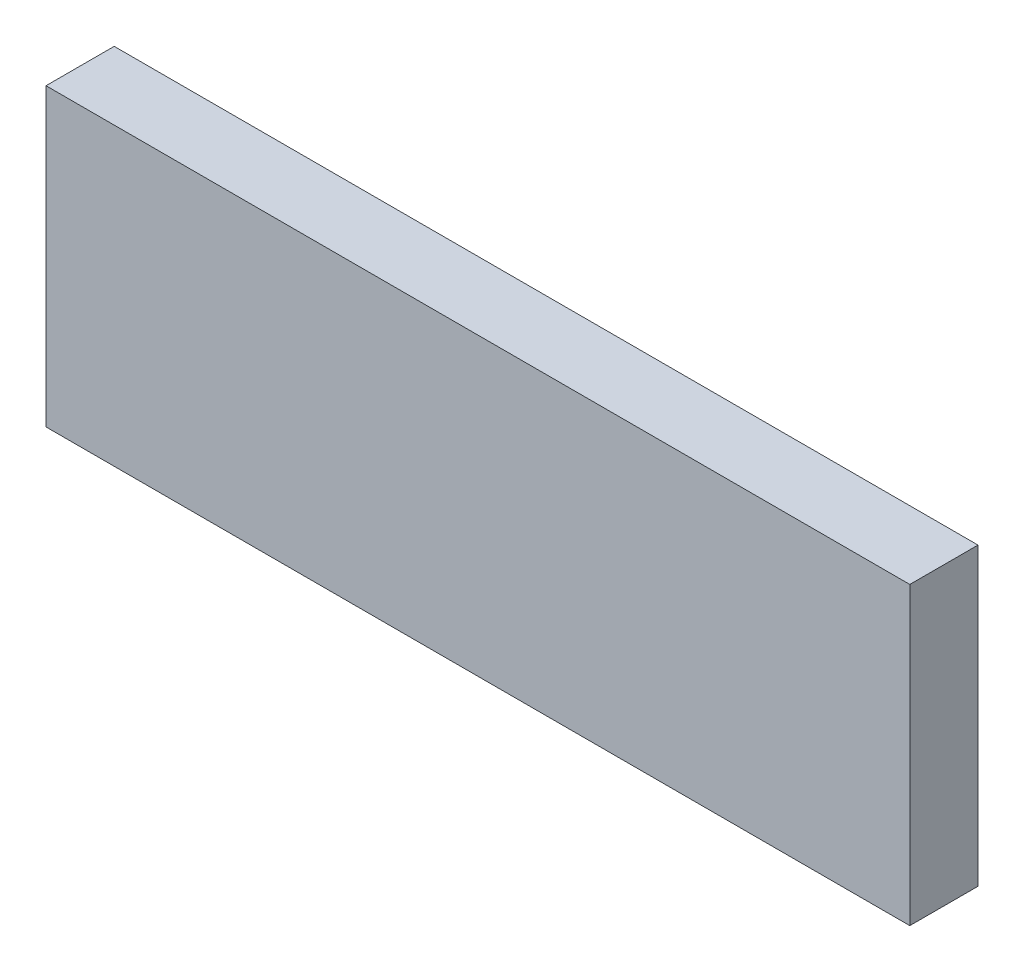
ISO-10303-21;
HEADER;
FILE_DESCRIPTION(('STEP AP214'),'2;1');
FILE_NAME('part.step','',(''),(''),'','','');
FILE_SCHEMA(('AUTOMOTIVE_DESIGN { 1 0 10303 214 1 1 1 1 }'));
ENDSEC;
DATA;
#1=APPLICATION_CONTEXT('core data for automotive mechanical design processes');
#2=APPLICATION_PROTOCOL_DEFINITION('international standard','automotive_design',2000,#1);
#3=PRODUCT_CONTEXT('',#1,'mechanical');
#4=PRODUCT('Part','Part','',(#3));
#5=PRODUCT_RELATED_PRODUCT_CATEGORY('part','',(#4));
#6=PRODUCT_DEFINITION_FORMATION('','',#4);
#7=PRODUCT_DEFINITION_CONTEXT('part definition',#1,'design');
#8=PRODUCT_DEFINITION('design','',#6,#7);
#9=PRODUCT_DEFINITION_SHAPE('','',#8);
#10=(LENGTH_UNIT() NAMED_UNIT(*) SI_UNIT(.MILLI.,.METRE.));
#11=(NAMED_UNIT(*) PLANE_ANGLE_UNIT() SI_UNIT($,.RADIAN.));
#12=(NAMED_UNIT(*) SI_UNIT($,.STERADIAN.) SOLID_ANGLE_UNIT());
#13=UNCERTAINTY_MEASURE_WITH_UNIT(LENGTH_MEASURE(1.E-05),#10,'distance_accuracy_value','');
#14=(GEOMETRIC_REPRESENTATION_CONTEXT(3) GLOBAL_UNCERTAINTY_ASSIGNED_CONTEXT((#13)) GLOBAL_UNIT_ASSIGNED_CONTEXT((#10,
#11,#12)) REPRESENTATION_CONTEXT('',''));
#15=CARTESIAN_POINT('',(0.,0.,0.));
#16=DIRECTION('',(0.,0.,1.));
#17=DIRECTION('',(1.,0.,0.));
#18=AXIS2_PLACEMENT_3D('',#15,#16,#17);
#19=CARTESIAN_POINT('',(-63.2282478866387,32.348980113118,3.));
#20=DIRECTION('',(1.,0.,0.));
#21=DIRECTION('',(0.,1.,0.));
#22=AXIS2_PLACEMENT_3D('',#19,#20,#21);
#23=PLANE('',#22);
#24=DIRECTION('',(0.,-1.,0.));
#25=VECTOR('',#24,1.);
#26=CARTESIAN_POINT('',(-63.2282478866387,32.348980113118,0.));
#27=LINE('',#26,#25);
#28=CARTESIAN_POINT('',(-63.2282478866387,32.348980113118,0.));
#29=VERTEX_POINT('',#28);
#30=CARTESIAN_POINT('',(-63.2282478866387,19.348980113118,0.));
#31=VERTEX_POINT('',#30);
#32=EDGE_CURVE('E98',#29,#31,#27,.T.);
#33=ORIENTED_EDGE('',*,*,#32,.T.);
#34=DIRECTION('',(0.,0.,-1.));
#35=VECTOR('',#34,1.);
#36=CARTESIAN_POINT('',(-63.2282478866387,19.348980113118,3.));
#37=LINE('',#36,#35);
#38=CARTESIAN_POINT('',(-63.2282478866387,19.348980113118,3.));
#39=VERTEX_POINT('',#38);
#40=EDGE_CURVE('E11',#39,#31,#37,.T.);
#41=ORIENTED_EDGE('',*,*,#40,.F.);
#42=DIRECTION('',(0.,-1.,0.));
#43=VECTOR('',#42,1.);
#44=CARTESIAN_POINT('',(-63.2282478866387,32.348980113118,3.));
#45=LINE('',#44,#43);
#46=CARTESIAN_POINT('',(-63.2282478866387,32.348980113118,3.));
#47=VERTEX_POINT('',#46);
#48=EDGE_CURVE('E86',#47,#39,#45,.T.);
#49=ORIENTED_EDGE('',*,*,#48,.F.);
#50=DIRECTION('',(0.,0.,-1.));
#51=VECTOR('',#50,1.);
#52=CARTESIAN_POINT('',(-63.2282478866387,32.348980113118,3.));
#53=LINE('',#52,#51);
#54=EDGE_CURVE('E94',#47,#29,#53,.T.);
#55=ORIENTED_EDGE('',*,*,#54,.T.);
#56=EDGE_LOOP('',(#33,#41,#49,#55));
#57=FACE_BOUND('',#56,.T.);
#58=ADVANCED_FACE('F35',(#57),#23,.F.);
#59=CARTESIAN_POINT('',(-63.2282478866387,19.348980113118,3.));
#60=DIRECTION('',(0.,1.,0.));
#61=DIRECTION('',(0.,0.,1.));
#62=AXIS2_PLACEMENT_3D('',#59,#60,#61);
#63=PLANE('',#62);
#64=DIRECTION('',(1.,0.,0.));
#65=VECTOR('',#64,1.);
#66=CARTESIAN_POINT('',(-63.2282478866387,19.348980113118,0.));
#67=LINE('',#66,#65);
#68=CARTESIAN_POINT('',(-25.2282478866387,19.348980113118,0.));
#69=VERTEX_POINT('',#68);
#70=EDGE_CURVE('E90',#31,#69,#67,.T.);
#71=ORIENTED_EDGE('',*,*,#70,.T.);
#72=DIRECTION('',(0.,0.,-1.));
#73=VECTOR('',#72,1.);
#74=CARTESIAN_POINT('',(-25.2282478866387,19.348980113118,3.));
#75=LINE('',#74,#73);
#76=CARTESIAN_POINT('',(-25.2282478866387,19.348980113118,3.));
#77=VERTEX_POINT('',#76);
#78=EDGE_CURVE('E43',#77,#69,#75,.T.);
#79=ORIENTED_EDGE('',*,*,#78,.F.);
#80=DIRECTION('',(1.,0.,0.));
#81=VECTOR('',#80,1.);
#82=CARTESIAN_POINT('',(-63.2282478866387,19.348980113118,3.));
#83=LINE('',#82,#81);
#84=EDGE_CURVE('E81',#39,#77,#83,.T.);
#85=ORIENTED_EDGE('',*,*,#84,.F.);
#86=ORIENTED_EDGE('',*,*,#40,.T.);
#87=EDGE_LOOP('',(#71,#79,#85,#86));
#88=FACE_BOUND('',#87,.T.);
#89=ADVANCED_FACE('F89',(#88),#63,.F.);
#90=CARTESIAN_POINT('',(-25.2282478866387,32.348980113118,3.));
#91=DIRECTION('',(-1.,0.,0.));
#92=DIRECTION('',(0.,-1.,0.));
#93=AXIS2_PLACEMENT_3D('',#90,#91,#92);
#94=PLANE('',#93);
#95=DIRECTION('',(0.,1.,0.));
#96=VECTOR('',#95,1.);
#97=CARTESIAN_POINT('',(-25.2282478866387,32.348980113118,0.));
#98=LINE('',#97,#96);
#99=CARTESIAN_POINT('',(-25.2282478866387,32.348980113118,0.));
#100=VERTEX_POINT('',#99);
#101=EDGE_CURVE('E68',#69,#100,#98,.T.);
#102=ORIENTED_EDGE('',*,*,#101,.T.);
#103=DIRECTION('',(0.,0.,-1.));
#104=VECTOR('',#103,1.);
#105=CARTESIAN_POINT('',(-25.2282478866387,32.348980113118,3.));
#106=LINE('',#105,#104);
#107=CARTESIAN_POINT('',(-25.2282478866387,32.348980113118,3.));
#108=VERTEX_POINT('',#107);
#109=EDGE_CURVE('E91',#108,#100,#106,.T.);
#110=ORIENTED_EDGE('',*,*,#109,.F.);
#111=DIRECTION('',(0.,1.,0.));
#112=VECTOR('',#111,1.);
#113=CARTESIAN_POINT('',(-25.2282478866387,32.348980113118,3.));
#114=LINE('',#113,#112);
#115=EDGE_CURVE('E84',#77,#108,#114,.T.);
#116=ORIENTED_EDGE('',*,*,#115,.F.);
#117=ORIENTED_EDGE('',*,*,#78,.T.);
#118=EDGE_LOOP('',(#102,#110,#116,#117));
#119=FACE_BOUND('',#118,.T.);
#120=ADVANCED_FACE('F92',(#119),#94,.F.);
#121=CARTESIAN_POINT('',(-63.2282478866387,32.348980113118,3.));
#122=DIRECTION('',(0.,-1.,0.));
#123=DIRECTION('',(0.,0.,-1.));
#124=AXIS2_PLACEMENT_3D('',#121,#122,#123);
#125=PLANE('',#124);
#126=DIRECTION('',(-1.,0.,0.));
#127=VECTOR('',#126,1.);
#128=CARTESIAN_POINT('',(-63.2282478866387,32.348980113118,0.));
#129=LINE('',#128,#127);
#130=EDGE_CURVE('E74',#100,#29,#129,.T.);
#131=ORIENTED_EDGE('',*,*,#130,.T.);
#132=ORIENTED_EDGE('',*,*,#54,.F.);
#133=DIRECTION('',(-1.,0.,0.));
#134=VECTOR('',#133,1.);
#135=CARTESIAN_POINT('',(-63.2282478866387,32.348980113118,3.));
#136=LINE('',#135,#134);
#137=EDGE_CURVE('E51',#108,#47,#136,.T.);
#138=ORIENTED_EDGE('',*,*,#137,.F.);
#139=ORIENTED_EDGE('',*,*,#109,.T.);
#140=EDGE_LOOP('',(#131,#132,#138,#139));
#141=FACE_BOUND('',#140,.T.);
#142=ADVANCED_FACE('F105',(#141),#125,.F.);
#143=CARTESIAN_POINT('',(0.,0.,3.));
#144=DIRECTION('',(0.,0.,1.));
#145=DIRECTION('',(1.,0.,0.));
#146=AXIS2_PLACEMENT_3D('',#143,#144,#145);
#147=PLANE('',#146);
#148=ORIENTED_EDGE('',*,*,#48,.T.);
#149=ORIENTED_EDGE('',*,*,#84,.T.);
#150=ORIENTED_EDGE('',*,*,#115,.T.);
#151=ORIENTED_EDGE('',*,*,#137,.T.);
#152=EDGE_LOOP('',(#148,#149,#150,#151));
#153=FACE_BOUND('',#152,.T.);
#154=ADVANCED_FACE('F82',(#153),#147,.T.);
#155=CARTESIAN_POINT('',(0.,0.,0.));
#156=DIRECTION('',(0.,0.,1.));
#157=DIRECTION('',(1.,0.,0.));
#158=AXIS2_PLACEMENT_3D('',#155,#156,#157);
#159=PLANE('',#158);
#160=ORIENTED_EDGE('',*,*,#32,.F.);
#161=ORIENTED_EDGE('',*,*,#130,.F.);
#162=ORIENTED_EDGE('',*,*,#101,.F.);
#163=ORIENTED_EDGE('',*,*,#70,.F.);
#164=EDGE_LOOP('',(#160,#161,#162,#163));
#165=FACE_BOUND('',#164,.T.);
#166=ADVANCED_FACE('F108',(#165),#159,.F.);
#167=CLOSED_SHELL('',(#58,#89,#120,#142,#154,#166));
#168=MANIFOLD_SOLID_BREP('B2',#167);
#169=ADVANCED_BREP_SHAPE_REPRESENTATION('',(#18,#168),#14);
#170=SHAPE_DEFINITION_REPRESENTATION(#9,#169);
ENDSEC;
END-ISO-10303-21;
